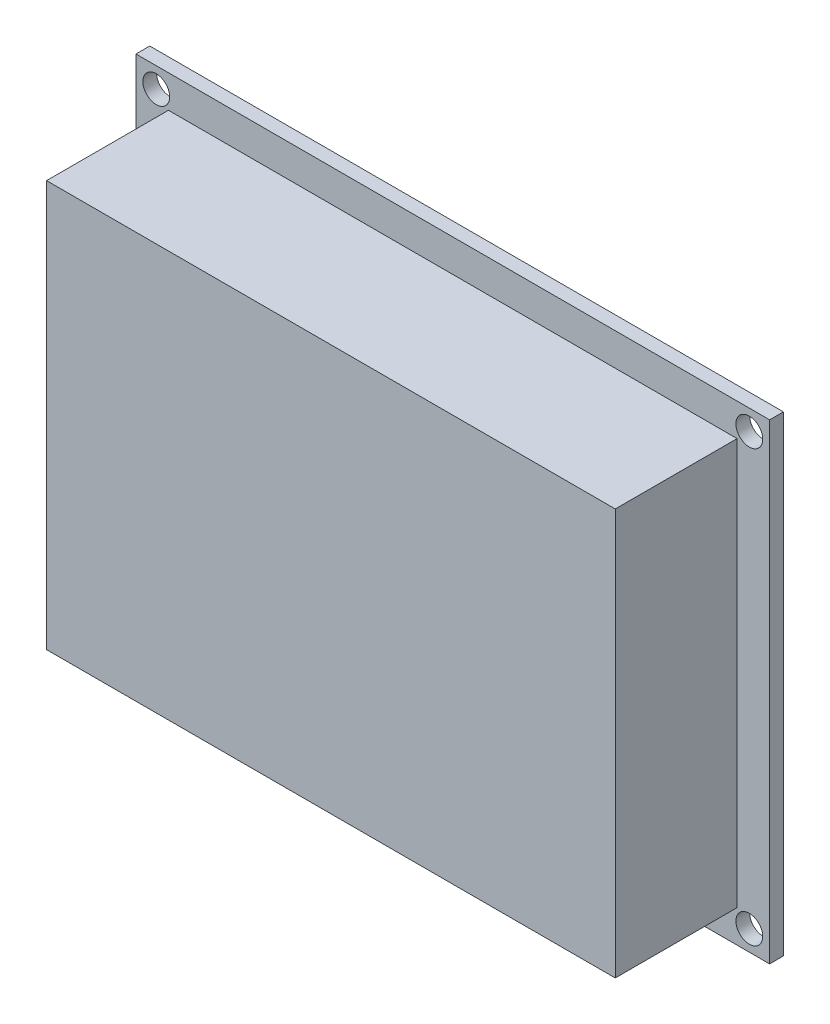
ISO-10303-21;
HEADER;
FILE_DESCRIPTION(('STEP AP214'),'2;1');
FILE_NAME('part.step','',(''),(''),'','','');
FILE_SCHEMA(('AUTOMOTIVE_DESIGN { 1 0 10303 214 1 1 1 1 }'));
ENDSEC;
DATA;
#1=APPLICATION_CONTEXT('core data for automotive mechanical design processes');
#2=APPLICATION_PROTOCOL_DEFINITION('international standard','automotive_design',2000,#1);
#3=PRODUCT_CONTEXT('',#1,'mechanical');
#4=PRODUCT('Part','Part','',(#3));
#5=PRODUCT_RELATED_PRODUCT_CATEGORY('part','',(#4));
#6=PRODUCT_DEFINITION_FORMATION('','',#4);
#7=PRODUCT_DEFINITION_CONTEXT('part definition',#1,'design');
#8=PRODUCT_DEFINITION('design','',#6,#7);
#9=PRODUCT_DEFINITION_SHAPE('','',#8);
#10=(LENGTH_UNIT() NAMED_UNIT(*) SI_UNIT(.MILLI.,.METRE.));
#11=(NAMED_UNIT(*) PLANE_ANGLE_UNIT() SI_UNIT($,.RADIAN.));
#12=(NAMED_UNIT(*) SI_UNIT($,.STERADIAN.) SOLID_ANGLE_UNIT());
#13=UNCERTAINTY_MEASURE_WITH_UNIT(LENGTH_MEASURE(1.E-05),#10,'distance_accuracy_value','');
#14=(GEOMETRIC_REPRESENTATION_CONTEXT(3) GLOBAL_UNCERTAINTY_ASSIGNED_CONTEXT((#13)) GLOBAL_UNIT_ASSIGNED_CONTEXT((#10,
#11,#12)) REPRESENTATION_CONTEXT('',''));
#15=CARTESIAN_POINT('',(0.,0.,0.));
#16=DIRECTION('',(0.,0.,1.));
#17=DIRECTION('',(1.,0.,0.));
#18=AXIS2_PLACEMENT_3D('',#15,#16,#17);
#19=CARTESIAN_POINT('',(0.,0.,1.7));
#20=DIRECTION('',(0.,0.,1.));
#21=DIRECTION('',(1.,0.,0.));
#22=AXIS2_PLACEMENT_3D('',#19,#20,#21);
#23=PLANE('',#22);
#24=CARTESIAN_POINT('',(36.5000000000001,-26.5,1.7));
#25=DIRECTION('',(0.,0.,1.));
#26=DIRECTION('',(1.,0.,0.));
#27=AXIS2_PLACEMENT_3D('',#24,#25,#26);
#28=CIRCLE('',#27,1.65);
#29=CARTESIAN_POINT('',(38.1500000000001,-26.5,1.7));
#30=VERTEX_POINT('',#29);
#31=EDGE_CURVE('E139',#30,#30,#28,.T.);
#32=ORIENTED_EDGE('',*,*,#31,.F.);
#33=EDGE_LOOP('',(#32));
#34=FACE_BOUND('',#33,.T.);
#35=CARTESIAN_POINT('',(-36.5,-26.5,1.7));
#36=DIRECTION('',(0.,0.,1.));
#37=DIRECTION('',(-1.,0.,0.));
#38=AXIS2_PLACEMENT_3D('',#35,#36,#37);
#39=CIRCLE('',#38,1.65);
#40=CARTESIAN_POINT('',(-38.15,-26.5,1.7));
#41=VERTEX_POINT('',#40);
#42=EDGE_CURVE('E153',#41,#41,#39,.T.);
#43=ORIENTED_EDGE('',*,*,#42,.F.);
#44=EDGE_LOOP('',(#43));
#45=FACE_BOUND('',#44,.T.);
#46=DIRECTION('',(0.,1.,0.));
#47=VECTOR('',#46,1.);
#48=CARTESIAN_POINT('',(39.,29.,1.7));
#49=LINE('',#48,#47);
#50=CARTESIAN_POINT('',(39.,-29.,1.7));
#51=VERTEX_POINT('',#50);
#52=CARTESIAN_POINT('',(39.,29.,1.7));
#53=VERTEX_POINT('',#52);
#54=EDGE_CURVE('E165',#51,#53,#49,.T.);
#55=ORIENTED_EDGE('',*,*,#54,.T.);
#56=DIRECTION('',(-1.,0.,0.));
#57=VECTOR('',#56,1.);
#58=CARTESIAN_POINT('',(-39.,29.,1.7));
#59=LINE('',#58,#57);
#60=CARTESIAN_POINT('',(-39.,29.,1.7));
#61=VERTEX_POINT('',#60);
#62=EDGE_CURVE('E89',#53,#61,#59,.T.);
#63=ORIENTED_EDGE('',*,*,#62,.T.);
#64=DIRECTION('',(0.,-1.,0.));
#65=VECTOR('',#64,1.);
#66=CARTESIAN_POINT('',(-39.,29.,1.7));
#67=LINE('',#66,#65);
#68=CARTESIAN_POINT('',(-39.,-29.,1.7));
#69=VERTEX_POINT('',#68);
#70=EDGE_CURVE('E168',#61,#69,#67,.T.);
#71=ORIENTED_EDGE('',*,*,#70,.T.);
#72=DIRECTION('',(1.,0.,0.));
#73=VECTOR('',#72,1.);
#74=CARTESIAN_POINT('',(-39.,-29.,1.7));
#75=LINE('',#74,#73);
#76=EDGE_CURVE('E61',#69,#51,#75,.T.);
#77=ORIENTED_EDGE('',*,*,#76,.T.);
#78=EDGE_LOOP('',(#55,#63,#71,#77));
#79=FACE_BOUND('',#78,.T.);
#80=CARTESIAN_POINT('',(-36.5,26.5,1.7));
#81=DIRECTION('',(0.,0.,1.));
#82=DIRECTION('',(1.,0.,0.));
#83=AXIS2_PLACEMENT_3D('',#80,#81,#82);
#84=CIRCLE('',#83,1.65);
#85=CARTESIAN_POINT('',(-34.85,26.5,1.7));
#86=VERTEX_POINT('',#85);
#87=EDGE_CURVE('E159',#86,#86,#84,.T.);
#88=ORIENTED_EDGE('',*,*,#87,.F.);
#89=EDGE_LOOP('',(#88));
#90=FACE_BOUND('',#89,.T.);
#91=CARTESIAN_POINT('',(36.5,26.5,1.7));
#92=DIRECTION('',(0.,0.,1.));
#93=DIRECTION('',(-1.,0.,0.));
#94=AXIS2_PLACEMENT_3D('',#91,#92,#93);
#95=CIRCLE('',#94,1.65);
#96=CARTESIAN_POINT('',(34.85,26.5,1.7));
#97=VERTEX_POINT('',#96);
#98=EDGE_CURVE('E147',#97,#97,#95,.T.);
#99=ORIENTED_EDGE('',*,*,#98,.F.);
#100=EDGE_LOOP('',(#99));
#101=FACE_BOUND('',#100,.T.);
#102=DIRECTION('',(-1.,0.,0.));
#103=VECTOR('',#102,1.);
#104=CARTESIAN_POINT('',(-35.,25.,1.7));
#105=LINE('',#104,#103);
#106=CARTESIAN_POINT('',(35.,25.,1.7));
#107=VERTEX_POINT('',#106);
#108=CARTESIAN_POINT('',(-35.,25.,1.7));
#109=VERTEX_POINT('',#108);
#110=EDGE_CURVE('E336',#107,#109,#105,.T.);
#111=ORIENTED_EDGE('',*,*,#110,.F.);
#112=DIRECTION('',(0.,1.,0.));
#113=VECTOR('',#112,1.);
#114=CARTESIAN_POINT('',(35.,-25.,1.7));
#115=LINE('',#114,#113);
#116=CARTESIAN_POINT('',(35.,-25.,1.7));
#117=VERTEX_POINT('',#116);
#118=EDGE_CURVE('E134',#117,#107,#115,.T.);
#119=ORIENTED_EDGE('',*,*,#118,.F.);
#120=DIRECTION('',(1.,0.,0.));
#121=VECTOR('',#120,1.);
#122=CARTESIAN_POINT('',(-35.,-25.,1.7));
#123=LINE('',#122,#121);
#124=CARTESIAN_POINT('',(-35.,-25.,1.7));
#125=VERTEX_POINT('',#124);
#126=EDGE_CURVE('E130',#125,#117,#123,.T.);
#127=ORIENTED_EDGE('',*,*,#126,.F.);
#128=DIRECTION('',(0.,-1.,0.));
#129=VECTOR('',#128,1.);
#130=CARTESIAN_POINT('',(-35.,-25.,1.7));
#131=LINE('',#130,#129);
#132=EDGE_CURVE('E333',#109,#125,#131,.T.);
#133=ORIENTED_EDGE('',*,*,#132,.F.);
#134=EDGE_LOOP('',(#111,#119,#127,#133));
#135=FACE_BOUND('',#134,.T.);
#136=ADVANCED_FACE('F37',(#34,#45,#79,#90,#101,#135),#23,.T.);
#137=CARTESIAN_POINT('',(0.,0.,0.));
#138=DIRECTION('',(0.,0.,1.));
#139=DIRECTION('',(1.,0.,0.));
#140=AXIS2_PLACEMENT_3D('',#137,#138,#139);
#141=PLANE('',#140);
#142=CARTESIAN_POINT('',(36.5,26.5,0.));
#143=DIRECTION('',(0.,0.,1.));
#144=DIRECTION('',(-1.,0.,0.));
#145=AXIS2_PLACEMENT_3D('',#142,#143,#144);
#146=CIRCLE('',#145,1.65);
#147=CARTESIAN_POINT('',(34.85,26.5,0.));
#148=VERTEX_POINT('',#147);
#149=EDGE_CURVE('E145',#148,#148,#146,.T.);
#150=ORIENTED_EDGE('',*,*,#149,.T.);
#151=EDGE_LOOP('',(#150));
#152=FACE_BOUND('',#151,.T.);
#153=CARTESIAN_POINT('',(-36.5,26.5,0.));
#154=DIRECTION('',(0.,0.,1.));
#155=DIRECTION('',(1.,0.,0.));
#156=AXIS2_PLACEMENT_3D('',#153,#154,#155);
#157=CIRCLE('',#156,1.65);
#158=CARTESIAN_POINT('',(-34.85,26.5,0.));
#159=VERTEX_POINT('',#158);
#160=EDGE_CURVE('E156',#159,#159,#157,.T.);
#161=ORIENTED_EDGE('',*,*,#160,.T.);
#162=EDGE_LOOP('',(#161));
#163=FACE_BOUND('',#162,.T.);
#164=DIRECTION('',(0.,1.,0.));
#165=VECTOR('',#164,1.);
#166=CARTESIAN_POINT('',(39.,29.,0.));
#167=LINE('',#166,#165);
#168=CARTESIAN_POINT('',(39.,-29.,0.));
#169=VERTEX_POINT('',#168);
#170=CARTESIAN_POINT('',(39.,29.,0.));
#171=VERTEX_POINT('',#170);
#172=EDGE_CURVE('E162',#169,#171,#167,.T.);
#173=ORIENTED_EDGE('',*,*,#172,.F.);
#174=DIRECTION('',(1.,0.,0.));
#175=VECTOR('',#174,1.);
#176=CARTESIAN_POINT('',(-39.,-29.,0.));
#177=LINE('',#176,#175);
#178=CARTESIAN_POINT('',(-39.,-29.,0.));
#179=VERTEX_POINT('',#178);
#180=EDGE_CURVE('E82',#179,#169,#177,.T.);
#181=ORIENTED_EDGE('',*,*,#180,.F.);
#182=DIRECTION('',(0.,-1.,0.));
#183=VECTOR('',#182,1.);
#184=CARTESIAN_POINT('',(-39.,29.,0.));
#185=LINE('',#184,#183);
#186=CARTESIAN_POINT('',(-39.,29.,0.));
#187=VERTEX_POINT('',#186);
#188=EDGE_CURVE('E176',#187,#179,#185,.T.);
#189=ORIENTED_EDGE('',*,*,#188,.F.);
#190=DIRECTION('',(-1.,0.,0.));
#191=VECTOR('',#190,1.);
#192=CARTESIAN_POINT('',(-39.,29.,0.));
#193=LINE('',#192,#191);
#194=EDGE_CURVE('E174',#171,#187,#193,.T.);
#195=ORIENTED_EDGE('',*,*,#194,.F.);
#196=EDGE_LOOP('',(#173,#181,#189,#195));
#197=FACE_BOUND('',#196,.T.);
#198=CARTESIAN_POINT('',(-36.5,-26.5,0.));
#199=DIRECTION('',(0.,0.,1.));
#200=DIRECTION('',(-1.,0.,0.));
#201=AXIS2_PLACEMENT_3D('',#198,#199,#200);
#202=CIRCLE('',#201,1.65);
#203=CARTESIAN_POINT('',(-38.15,-26.5,0.));
#204=VERTEX_POINT('',#203);
#205=EDGE_CURVE('E150',#204,#204,#202,.T.);
#206=ORIENTED_EDGE('',*,*,#205,.T.);
#207=EDGE_LOOP('',(#206));
#208=FACE_BOUND('',#207,.T.);
#209=CARTESIAN_POINT('',(36.5000000000001,-26.5,0.));
#210=DIRECTION('',(0.,0.,1.));
#211=DIRECTION('',(1.,0.,0.));
#212=AXIS2_PLACEMENT_3D('',#209,#210,#211);
#213=CIRCLE('',#212,1.65);
#214=CARTESIAN_POINT('',(38.1500000000001,-26.5,0.));
#215=VERTEX_POINT('',#214);
#216=EDGE_CURVE('E136',#215,#215,#213,.T.);
#217=ORIENTED_EDGE('',*,*,#216,.T.);
#218=EDGE_LOOP('',(#217));
#219=FACE_BOUND('',#218,.T.);
#220=ADVANCED_FACE('F189',(#152,#163,#197,#208,#219),#141,.F.);
#221=CARTESIAN_POINT('',(39.,29.,1.7));
#222=DIRECTION('',(-1.,0.,0.));
#223=DIRECTION('',(0.,-1.,0.));
#224=AXIS2_PLACEMENT_3D('',#221,#222,#223);
#225=PLANE('',#224);
#226=ORIENTED_EDGE('',*,*,#172,.T.);
#227=DIRECTION('',(0.,0.,-1.));
#228=VECTOR('',#227,1.);
#229=CARTESIAN_POINT('',(39.,29.,1.7));
#230=LINE('',#229,#228);
#231=EDGE_CURVE('E11',#53,#171,#230,.T.);
#232=ORIENTED_EDGE('',*,*,#231,.F.);
#233=ORIENTED_EDGE('',*,*,#54,.F.);
#234=DIRECTION('',(0.,0.,-1.));
#235=VECTOR('',#234,1.);
#236=CARTESIAN_POINT('',(39.,-29.,1.7));
#237=LINE('',#236,#235);
#238=EDGE_CURVE('E171',#51,#169,#237,.T.);
#239=ORIENTED_EDGE('',*,*,#238,.T.);
#240=EDGE_LOOP('',(#226,#232,#233,#239));
#241=FACE_BOUND('',#240,.T.);
#242=ADVANCED_FACE('F39',(#241),#225,.F.);
#243=CARTESIAN_POINT('',(-39.,29.,1.7));
#244=DIRECTION('',(0.,-1.,0.));
#245=DIRECTION('',(0.,0.,-1.));
#246=AXIS2_PLACEMENT_3D('',#243,#244,#245);
#247=PLANE('',#246);
#248=ORIENTED_EDGE('',*,*,#194,.T.);
#249=DIRECTION('',(0.,0.,-1.));
#250=VECTOR('',#249,1.);
#251=CARTESIAN_POINT('',(-39.,29.,1.7));
#252=LINE('',#251,#250);
#253=EDGE_CURVE('E45',#61,#187,#252,.T.);
#254=ORIENTED_EDGE('',*,*,#253,.F.);
#255=ORIENTED_EDGE('',*,*,#62,.F.);
#256=ORIENTED_EDGE('',*,*,#231,.T.);
#257=EDGE_LOOP('',(#248,#254,#255,#256));
#258=FACE_BOUND('',#257,.T.);
#259=ADVANCED_FACE('F205',(#258),#247,.F.);
#260=CARTESIAN_POINT('',(-39.,29.,1.7));
#261=DIRECTION('',(1.,0.,0.));
#262=DIRECTION('',(0.,0.,-1.));
#263=AXIS2_PLACEMENT_3D('',#260,#261,#262);
#264=PLANE('',#263);
#265=ORIENTED_EDGE('',*,*,#188,.T.);
#266=DIRECTION('',(0.,0.,-1.));
#267=VECTOR('',#266,1.);
#268=CARTESIAN_POINT('',(-39.,-29.,1.7));
#269=LINE('',#268,#267);
#270=EDGE_CURVE('E180',#69,#179,#269,.T.);
#271=ORIENTED_EDGE('',*,*,#270,.F.);
#272=ORIENTED_EDGE('',*,*,#70,.F.);
#273=ORIENTED_EDGE('',*,*,#253,.T.);
#274=EDGE_LOOP('',(#265,#271,#272,#273));
#275=FACE_BOUND('',#274,.T.);
#276=ADVANCED_FACE('F185',(#275),#264,.F.);
#277=CARTESIAN_POINT('',(-39.,-29.,1.7));
#278=DIRECTION('',(0.,1.,0.));
#279=DIRECTION('',(0.,0.,1.));
#280=AXIS2_PLACEMENT_3D('',#277,#278,#279);
#281=PLANE('',#280);
#282=ORIENTED_EDGE('',*,*,#180,.T.);
#283=ORIENTED_EDGE('',*,*,#238,.F.);
#284=ORIENTED_EDGE('',*,*,#76,.F.);
#285=ORIENTED_EDGE('',*,*,#270,.T.);
#286=EDGE_LOOP('',(#282,#283,#284,#285));
#287=FACE_BOUND('',#286,.T.);
#288=ADVANCED_FACE('F194',(#287),#281,.F.);
#289=CARTESIAN_POINT('',(-36.5,26.5,1.7));
#290=DIRECTION('',(0.,0.,-1.));
#291=DIRECTION('',(-1.,0.,0.));
#292=AXIS2_PLACEMENT_3D('',#289,#290,#291);
#293=CYLINDRICAL_SURFACE('',#292,1.65);
#294=ORIENTED_EDGE('',*,*,#87,.T.);
#295=EDGE_LOOP('',(#294));
#296=FACE_BOUND('',#295,.T.);
#297=ORIENTED_EDGE('',*,*,#160,.F.);
#298=EDGE_LOOP('',(#297));
#299=FACE_BOUND('',#298,.T.);
#300=ADVANCED_FACE('F196',(#296,#299),#293,.F.);
#301=CARTESIAN_POINT('',(-36.5,-26.5,1.7));
#302=DIRECTION('',(0.,0.,-1.));
#303=DIRECTION('',(-1.,0.,0.));
#304=AXIS2_PLACEMENT_3D('',#301,#302,#303);
#305=CYLINDRICAL_SURFACE('',#304,1.65);
#306=ORIENTED_EDGE('',*,*,#42,.T.);
#307=EDGE_LOOP('',(#306));
#308=FACE_BOUND('',#307,.T.);
#309=ORIENTED_EDGE('',*,*,#205,.F.);
#310=EDGE_LOOP('',(#309));
#311=FACE_BOUND('',#310,.T.);
#312=ADVANCED_FACE('F202',(#308,#311),#305,.F.);
#313=CARTESIAN_POINT('',(36.5,26.5,1.7));
#314=DIRECTION('',(0.,0.,-1.));
#315=DIRECTION('',(-1.,0.,0.));
#316=AXIS2_PLACEMENT_3D('',#313,#314,#315);
#317=CYLINDRICAL_SURFACE('',#316,1.65);
#318=ORIENTED_EDGE('',*,*,#98,.T.);
#319=EDGE_LOOP('',(#318));
#320=FACE_BOUND('',#319,.T.);
#321=ORIENTED_EDGE('',*,*,#149,.F.);
#322=EDGE_LOOP('',(#321));
#323=FACE_BOUND('',#322,.T.);
#324=ADVANCED_FACE('F222',(#320,#323),#317,.F.);
#325=CARTESIAN_POINT('',(36.5000000000001,-26.5,1.7));
#326=DIRECTION('',(0.,0.,-1.));
#327=DIRECTION('',(-1.,0.,0.));
#328=AXIS2_PLACEMENT_3D('',#325,#326,#327);
#329=CYLINDRICAL_SURFACE('',#328,1.65);
#330=ORIENTED_EDGE('',*,*,#31,.T.);
#331=EDGE_LOOP('',(#330));
#332=FACE_BOUND('',#331,.T.);
#333=ORIENTED_EDGE('',*,*,#216,.F.);
#334=EDGE_LOOP('',(#333));
#335=FACE_BOUND('',#334,.T.);
#336=ADVANCED_FACE('F226',(#332,#335),#329,.F.);
#337=CARTESIAN_POINT('',(35.,-25.,16.7));
#338=DIRECTION('',(-1.,0.,0.));
#339=DIRECTION('',(0.,0.,1.));
#340=AXIS2_PLACEMENT_3D('',#337,#338,#339);
#341=PLANE('',#340);
#342=ORIENTED_EDGE('',*,*,#118,.T.);
#343=DIRECTION('',(0.,0.,-1.));
#344=VECTOR('',#343,1.);
#345=CARTESIAN_POINT('',(35.,25.,16.7));
#346=LINE('',#345,#344);
#347=CARTESIAN_POINT('',(35.,25.,16.7));
#348=VERTEX_POINT('',#347);
#349=EDGE_CURVE('E115',#348,#107,#346,.T.);
#350=ORIENTED_EDGE('',*,*,#349,.F.);
#351=DIRECTION('',(0.,1.,0.));
#352=VECTOR('',#351,1.);
#353=CARTESIAN_POINT('',(35.,-25.,16.7));
#354=LINE('',#353,#352);
#355=CARTESIAN_POINT('',(35.,-25.,16.7));
#356=VERTEX_POINT('',#355);
#357=EDGE_CURVE('E122',#356,#348,#354,.T.);
#358=ORIENTED_EDGE('',*,*,#357,.F.);
#359=DIRECTION('',(0.,0.,-1.));
#360=VECTOR('',#359,1.);
#361=CARTESIAN_POINT('',(35.,-25.,16.7));
#362=LINE('',#361,#360);
#363=EDGE_CURVE('E330',#356,#117,#362,.T.);
#364=ORIENTED_EDGE('',*,*,#363,.T.);
#365=EDGE_LOOP('',(#342,#350,#358,#364));
#366=FACE_BOUND('',#365,.T.);
#367=ADVANCED_FACE('F132',(#366),#341,.F.);
#368=CARTESIAN_POINT('',(-35.,25.,16.7));
#369=DIRECTION('',(0.,-1.,0.));
#370=DIRECTION('',(0.,0.,-1.));
#371=AXIS2_PLACEMENT_3D('',#368,#369,#370);
#372=PLANE('',#371);
#373=ORIENTED_EDGE('',*,*,#110,.T.);
#374=DIRECTION('',(0.,0.,-1.));
#375=VECTOR('',#374,1.);
#376=CARTESIAN_POINT('',(-35.,25.,16.7));
#377=LINE('',#376,#375);
#378=CARTESIAN_POINT('',(-35.,25.,16.7));
#379=VERTEX_POINT('',#378);
#380=EDGE_CURVE('E118',#379,#109,#377,.T.);
#381=ORIENTED_EDGE('',*,*,#380,.F.);
#382=DIRECTION('',(-1.,0.,0.));
#383=VECTOR('',#382,1.);
#384=CARTESIAN_POINT('',(-35.,25.,16.7));
#385=LINE('',#384,#383);
#386=EDGE_CURVE('E111',#348,#379,#385,.T.);
#387=ORIENTED_EDGE('',*,*,#386,.F.);
#388=ORIENTED_EDGE('',*,*,#349,.T.);
#389=EDGE_LOOP('',(#373,#381,#387,#388));
#390=FACE_BOUND('',#389,.T.);
#391=ADVANCED_FACE('F113',(#390),#372,.F.);
#392=CARTESIAN_POINT('',(-35.,-25.,16.7));
#393=DIRECTION('',(1.,0.,0.));
#394=DIRECTION('',(0.,0.,-1.));
#395=AXIS2_PLACEMENT_3D('',#392,#393,#394);
#396=PLANE('',#395);
#397=ORIENTED_EDGE('',*,*,#132,.T.);
#398=DIRECTION('',(0.,0.,-1.));
#399=VECTOR('',#398,1.);
#400=CARTESIAN_POINT('',(-35.,-25.,16.7));
#401=LINE('',#400,#399);
#402=CARTESIAN_POINT('',(-35.,-25.,16.7));
#403=VERTEX_POINT('',#402);
#404=EDGE_CURVE('E52',#403,#125,#401,.T.);
#405=ORIENTED_EDGE('',*,*,#404,.F.);
#406=DIRECTION('',(0.,-1.,0.));
#407=VECTOR('',#406,1.);
#408=CARTESIAN_POINT('',(-35.,-25.,16.7));
#409=LINE('',#408,#407);
#410=EDGE_CURVE('E121',#379,#403,#409,.T.);
#411=ORIENTED_EDGE('',*,*,#410,.F.);
#412=ORIENTED_EDGE('',*,*,#380,.T.);
#413=EDGE_LOOP('',(#397,#405,#411,#412));
#414=FACE_BOUND('',#413,.T.);
#415=ADVANCED_FACE('F235',(#414),#396,.F.);
#416=CARTESIAN_POINT('',(-35.,-25.,16.7));
#417=DIRECTION('',(0.,1.,0.));
#418=DIRECTION('',(0.,0.,1.));
#419=AXIS2_PLACEMENT_3D('',#416,#417,#418);
#420=PLANE('',#419);
#421=ORIENTED_EDGE('',*,*,#126,.T.);
#422=ORIENTED_EDGE('',*,*,#363,.F.);
#423=DIRECTION('',(1.,0.,0.));
#424=VECTOR('',#423,1.);
#425=CARTESIAN_POINT('',(-35.,-25.,16.7));
#426=LINE('',#425,#424);
#427=EDGE_CURVE('E126',#403,#356,#426,.T.);
#428=ORIENTED_EDGE('',*,*,#427,.F.);
#429=ORIENTED_EDGE('',*,*,#404,.T.);
#430=EDGE_LOOP('',(#421,#422,#428,#429));
#431=FACE_BOUND('',#430,.T.);
#432=ADVANCED_FACE('F238',(#431),#420,.F.);
#433=CARTESIAN_POINT('',(0.,0.,16.7));
#434=DIRECTION('',(0.,0.,-1.));
#435=DIRECTION('',(-1.,0.,0.));
#436=AXIS2_PLACEMENT_3D('',#433,#434,#435);
#437=PLANE('',#436);
#438=ORIENTED_EDGE('',*,*,#357,.T.);
#439=ORIENTED_EDGE('',*,*,#386,.T.);
#440=ORIENTED_EDGE('',*,*,#410,.T.);
#441=ORIENTED_EDGE('',*,*,#427,.T.);
#442=EDGE_LOOP('',(#438,#439,#440,#441));
#443=FACE_BOUND('',#442,.T.);
#444=ADVANCED_FACE('F125',(#443),#437,.F.);
#445=CLOSED_SHELL('',(#136,#220,#242,#259,#276,#288,#300,#312,#324,#336,#367,#391,#415,#432,#444));
#446=MANIFOLD_SOLID_BREP('B2',#445);
#447=ADVANCED_BREP_SHAPE_REPRESENTATION('',(#18,#446),#14);
#448=SHAPE_DEFINITION_REPRESENTATION(#9,#447);
ENDSEC;
END-ISO-10303-21;
